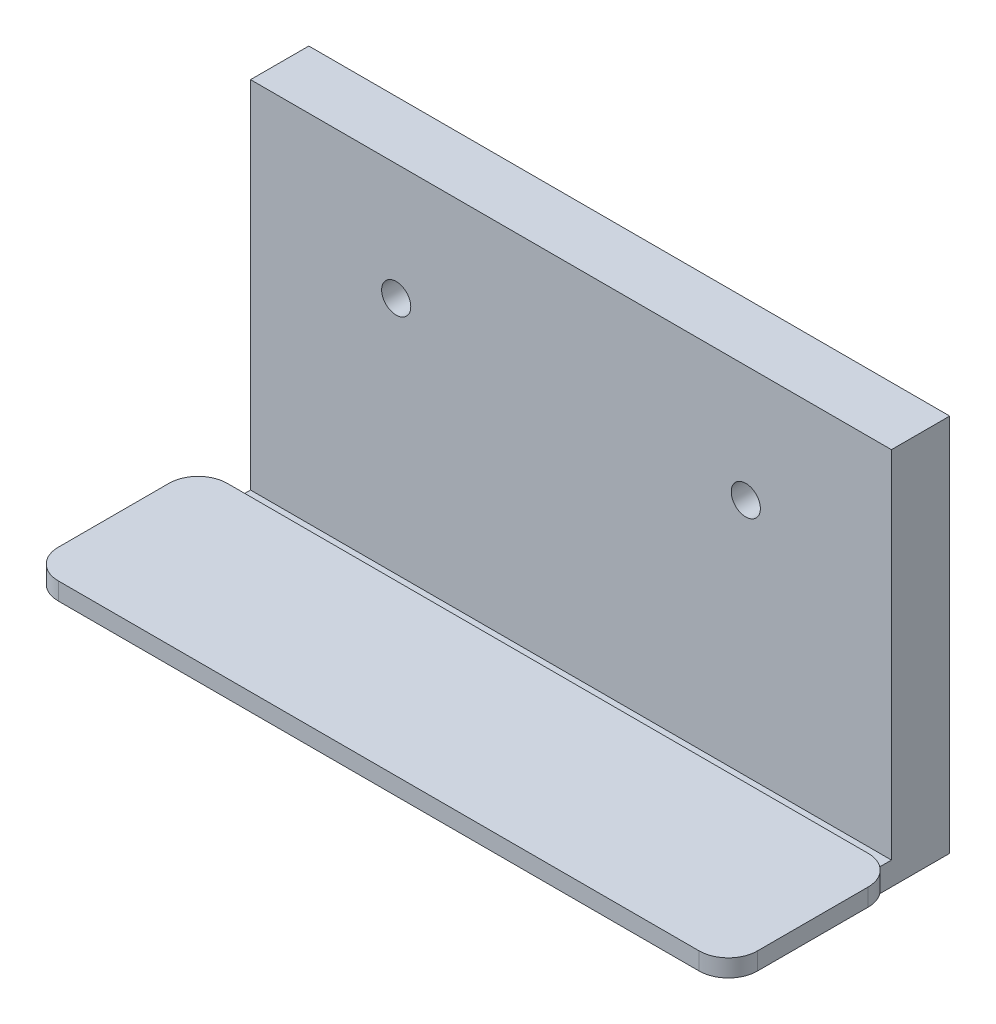
ISO-10303-21;
HEADER;
FILE_DESCRIPTION(('STEP AP214'),'2;1');
FILE_NAME('part.step','',(''),(''),'','','');
FILE_SCHEMA(('AUTOMOTIVE_DESIGN { 1 0 10303 214 1 1 1 1 }'));
ENDSEC;
DATA;
#1=APPLICATION_CONTEXT('core data for automotive mechanical design processes');
#2=APPLICATION_PROTOCOL_DEFINITION('international standard','automotive_design',2000,#1);
#3=PRODUCT_CONTEXT('',#1,'mechanical');
#4=PRODUCT('Part','Part','',(#3));
#5=PRODUCT_RELATED_PRODUCT_CATEGORY('part','',(#4));
#6=PRODUCT_DEFINITION_FORMATION('','',#4);
#7=PRODUCT_DEFINITION_CONTEXT('part definition',#1,'design');
#8=PRODUCT_DEFINITION('design','',#6,#7);
#9=PRODUCT_DEFINITION_SHAPE('','',#8);
#10=(LENGTH_UNIT() NAMED_UNIT(*) SI_UNIT(.MILLI.,.METRE.));
#11=(NAMED_UNIT(*) PLANE_ANGLE_UNIT() SI_UNIT($,.RADIAN.));
#12=(NAMED_UNIT(*) SI_UNIT($,.STERADIAN.) SOLID_ANGLE_UNIT());
#13=UNCERTAINTY_MEASURE_WITH_UNIT(LENGTH_MEASURE(1.E-05),#10,'distance_accuracy_value','');
#14=(GEOMETRIC_REPRESENTATION_CONTEXT(3) GLOBAL_UNCERTAINTY_ASSIGNED_CONTEXT((#13)) GLOBAL_UNIT_ASSIGNED_CONTEXT((#10,
#11,#12)) REPRESENTATION_CONTEXT('',''));
#15=CARTESIAN_POINT('',(0.,0.,0.));
#16=DIRECTION('',(0.,0.,1.));
#17=DIRECTION('',(1.,0.,0.));
#18=AXIS2_PLACEMENT_3D('',#15,#16,#17);
#19=CARTESIAN_POINT('',(-55.,-28.5,30.));
#20=DIRECTION('',(0.,-1.,0.));
#21=DIRECTION('',(0.,0.,-1.));
#22=AXIS2_PLACEMENT_3D('',#19,#20,#21);
#23=PLANE('',#22);
#24=DIRECTION('',(-1.,0.,0.));
#25=VECTOR('',#24,1.);
#26=CARTESIAN_POINT('',(60.,-28.5,14.));
#27=LINE('',#26,#25);
#28=CARTESIAN_POINT('',(55.,-28.5,14.));
#29=VERTEX_POINT('',#28);
#30=CARTESIAN_POINT('',(-55.,-28.5,14.));
#31=VERTEX_POINT('',#30);
#32=EDGE_CURVE('E152',#29,#31,#27,.T.);
#33=ORIENTED_EDGE('',*,*,#32,.F.);
#34=DIRECTION('',(0.,0.,-1.));
#35=VECTOR('',#34,1.);
#36=CARTESIAN_POINT('',(55.,-28.5,30.));
#37=LINE('',#36,#35);
#38=CARTESIAN_POINT('',(55.,-28.5,10.));
#39=VERTEX_POINT('',#38);
#40=EDGE_CURVE('E169',#29,#39,#37,.T.);
#41=ORIENTED_EDGE('',*,*,#40,.T.);
#42=DIRECTION('',(-1.,0.,0.));
#43=VECTOR('',#42,1.);
#44=CARTESIAN_POINT('',(-55.,-28.5,10.));
#45=LINE('',#44,#43);
#46=CARTESIAN_POINT('',(-55.,-28.5,10.));
#47=VERTEX_POINT('',#46);
#48=EDGE_CURVE('E253',#39,#47,#45,.T.);
#49=ORIENTED_EDGE('',*,*,#48,.T.);
#50=DIRECTION('',(0.,0.,-1.));
#51=VECTOR('',#50,1.);
#52=CARTESIAN_POINT('',(-55.,-28.5,30.));
#53=LINE('',#52,#51);
#54=EDGE_CURVE('E174',#31,#47,#53,.T.);
#55=ORIENTED_EDGE('',*,*,#54,.F.);
#56=EDGE_LOOP('',(#33,#41,#49,#55));
#57=FACE_BOUND('',#56,.T.);
#58=ADVANCED_FACE('F32',(#57),#23,.F.);
#59=CARTESIAN_POINT('',(0.,0.,10.));
#60=DIRECTION('',(0.,0.,-1.));
#61=DIRECTION('',(-1.,0.,0.));
#62=AXIS2_PLACEMENT_3D('',#59,#60,#61);
#63=PLANE('',#62);
#64=CARTESIAN_POINT('',(30.,12.5,10.));
#65=DIRECTION('',(0.,0.,1.));
#66=DIRECTION('',(1.,0.,0.));
#67=AXIS2_PLACEMENT_3D('',#64,#65,#66);
#68=CIRCLE('',#67,2.5);
#69=CARTESIAN_POINT('',(32.5,12.5,10.));
#70=VERTEX_POINT('',#69);
#71=EDGE_CURVE('E274',#70,#70,#68,.T.);
#72=ORIENTED_EDGE('',*,*,#71,.F.);
#73=EDGE_LOOP('',(#72));
#74=FACE_BOUND('',#73,.T.);
#75=CARTESIAN_POINT('',(-30.,12.5,10.));
#76=DIRECTION('',(0.,0.,1.));
#77=DIRECTION('',(1.,0.,0.));
#78=AXIS2_PLACEMENT_3D('',#75,#76,#77);
#79=CIRCLE('',#78,2.5);
#80=CARTESIAN_POINT('',(-27.5,12.5,10.));
#81=VERTEX_POINT('',#80);
#82=EDGE_CURVE('E266',#81,#81,#79,.T.);
#83=ORIENTED_EDGE('',*,*,#82,.F.);
#84=EDGE_LOOP('',(#83));
#85=FACE_BOUND('',#84,.T.);
#86=ORIENTED_EDGE('',*,*,#48,.F.);
#87=DIRECTION('',(0.,1.,0.));
#88=VECTOR('',#87,1.);
#89=CARTESIAN_POINT('',(55.,-32.5,10.));
#90=LINE('',#89,#88);
#91=CARTESIAN_POINT('',(55.,32.5,10.));
#92=VERTEX_POINT('',#91);
#93=EDGE_CURVE('E183',#39,#92,#90,.T.);
#94=ORIENTED_EDGE('',*,*,#93,.T.);
#95=DIRECTION('',(-1.,0.,0.));
#96=VECTOR('',#95,1.);
#97=CARTESIAN_POINT('',(-55.,32.5,10.));
#98=LINE('',#97,#96);
#99=CARTESIAN_POINT('',(-55.,32.5,10.));
#100=VERTEX_POINT('',#99);
#101=EDGE_CURVE('E189',#92,#100,#98,.T.);
#102=ORIENTED_EDGE('',*,*,#101,.T.);
#103=DIRECTION('',(0.,-1.,0.));
#104=VECTOR('',#103,1.);
#105=CARTESIAN_POINT('',(-55.,-32.5,10.));
#106=LINE('',#105,#104);
#107=EDGE_CURVE('E192',#100,#47,#106,.T.);
#108=ORIENTED_EDGE('',*,*,#107,.T.);
#109=EDGE_LOOP('',(#86,#94,#102,#108));
#110=FACE_BOUND('',#109,.T.);
#111=ADVANCED_FACE('F293',(#74,#85,#110),#63,.F.);
#112=CARTESIAN_POINT('',(55.,-32.5,10.));
#113=DIRECTION('',(-1.,0.,0.));
#114=DIRECTION('',(0.,0.,1.));
#115=AXIS2_PLACEMENT_3D('',#112,#113,#114);
#116=PLANE('',#115);
#117=DIRECTION('',(0.,1.,0.));
#118=VECTOR('',#117,1.);
#119=CARTESIAN_POINT('',(55.,-32.5,0.));
#120=LINE('',#119,#118);
#121=CARTESIAN_POINT('',(55.,-32.5,0.));
#122=VERTEX_POINT('',#121);
#123=CARTESIAN_POINT('',(55.,32.5,0.));
#124=VERTEX_POINT('',#123);
#125=EDGE_CURVE('E168',#122,#124,#120,.T.);
#126=ORIENTED_EDGE('',*,*,#125,.T.);
#127=DIRECTION('',(0.,0.,-1.));
#128=VECTOR('',#127,1.);
#129=CARTESIAN_POINT('',(55.,32.5,10.));
#130=LINE('',#129,#128);
#131=EDGE_CURVE('E210',#92,#124,#130,.T.);
#132=ORIENTED_EDGE('',*,*,#131,.F.);
#133=ORIENTED_EDGE('',*,*,#93,.F.);
#134=ORIENTED_EDGE('',*,*,#40,.F.);
#135=CARTESIAN_POINT('',(55.,-28.5,30.));
#136=VERTEX_POINT('',#135);
#137=EDGE_CURVE('E160',#136,#29,#37,.T.);
#138=ORIENTED_EDGE('',*,*,#137,.F.);
#139=DIRECTION('',(0.,1.,0.));
#140=VECTOR('',#139,1.);
#141=CARTESIAN_POINT('',(55.,-32.5,30.));
#142=LINE('',#141,#140);
#143=CARTESIAN_POINT('',(55.,-32.5,30.));
#144=VERTEX_POINT('',#143);
#145=EDGE_CURVE('E256',#144,#136,#142,.T.);
#146=ORIENTED_EDGE('',*,*,#145,.F.);
#147=DIRECTION('',(0.,0.,-1.));
#148=VECTOR('',#147,1.);
#149=CARTESIAN_POINT('',(55.,-32.5,10.));
#150=LINE('',#149,#148);
#151=EDGE_CURVE('E195',#144,#122,#150,.T.);
#152=ORIENTED_EDGE('',*,*,#151,.T.);
#153=EDGE_LOOP('',(#126,#132,#133,#134,#138,#146,#152));
#154=FACE_BOUND('',#153,.T.);
#155=ADVANCED_FACE('F181',(#154),#116,.F.);
#156=CARTESIAN_POINT('',(-55.,32.5,10.));
#157=DIRECTION('',(0.,-1.,0.));
#158=DIRECTION('',(0.,0.,-1.));
#159=AXIS2_PLACEMENT_3D('',#156,#157,#158);
#160=PLANE('',#159);
#161=DIRECTION('',(-1.,0.,0.));
#162=VECTOR('',#161,1.);
#163=CARTESIAN_POINT('',(-55.,32.5,0.));
#164=LINE('',#163,#162);
#165=CARTESIAN_POINT('',(-55.,32.5,0.));
#166=VERTEX_POINT('',#165);
#167=EDGE_CURVE('E197',#124,#166,#164,.T.);
#168=ORIENTED_EDGE('',*,*,#167,.T.);
#169=DIRECTION('',(0.,0.,-1.));
#170=VECTOR('',#169,1.);
#171=CARTESIAN_POINT('',(-55.,32.5,10.));
#172=LINE('',#171,#170);
#173=EDGE_CURVE('E207',#100,#166,#172,.T.);
#174=ORIENTED_EDGE('',*,*,#173,.F.);
#175=ORIENTED_EDGE('',*,*,#101,.F.);
#176=ORIENTED_EDGE('',*,*,#131,.T.);
#177=EDGE_LOOP('',(#168,#174,#175,#176));
#178=FACE_BOUND('',#177,.T.);
#179=ADVANCED_FACE('F315',(#178),#160,.F.);
#180=CARTESIAN_POINT('',(-55.,-32.5,10.));
#181=DIRECTION('',(1.,0.,0.));
#182=DIRECTION('',(0.,0.,-1.));
#183=AXIS2_PLACEMENT_3D('',#180,#181,#182);
#184=PLANE('',#183);
#185=DIRECTION('',(0.,-1.,0.));
#186=VECTOR('',#185,1.);
#187=CARTESIAN_POINT('',(-55.,-32.5,0.));
#188=LINE('',#187,#186);
#189=CARTESIAN_POINT('',(-55.,-32.5,0.));
#190=VERTEX_POINT('',#189);
#191=EDGE_CURVE('E199',#166,#190,#188,.T.);
#192=ORIENTED_EDGE('',*,*,#191,.T.);
#193=DIRECTION('',(0.,0.,-1.));
#194=VECTOR('',#193,1.);
#195=CARTESIAN_POINT('',(-55.,-32.5,10.));
#196=LINE('',#195,#194);
#197=CARTESIAN_POINT('',(-55.,-32.5,30.));
#198=VERTEX_POINT('',#197);
#199=EDGE_CURVE('E204',#198,#190,#196,.T.);
#200=ORIENTED_EDGE('',*,*,#199,.F.);
#201=DIRECTION('',(0.,-1.,0.));
#202=VECTOR('',#201,1.);
#203=CARTESIAN_POINT('',(-55.,-32.5,30.));
#204=LINE('',#203,#202);
#205=CARTESIAN_POINT('',(-55.,-28.5,30.));
#206=VERTEX_POINT('',#205);
#207=EDGE_CURVE('E249',#206,#198,#204,.T.);
#208=ORIENTED_EDGE('',*,*,#207,.F.);
#209=EDGE_CURVE('E184',#206,#31,#53,.T.);
#210=ORIENTED_EDGE('',*,*,#209,.T.);
#211=ORIENTED_EDGE('',*,*,#54,.T.);
#212=ORIENTED_EDGE('',*,*,#107,.F.);
#213=ORIENTED_EDGE('',*,*,#173,.T.);
#214=EDGE_LOOP('',(#192,#200,#208,#210,#211,#212,#213));
#215=FACE_BOUND('',#214,.T.);
#216=ADVANCED_FACE('F311',(#215),#184,.F.);
#217=CARTESIAN_POINT('',(-55.,-32.5,10.));
#218=DIRECTION('',(0.,1.,0.));
#219=DIRECTION('',(0.,0.,1.));
#220=AXIS2_PLACEMENT_3D('',#217,#218,#219);
#221=PLANE('',#220);
#222=DIRECTION('',(1.,0.,0.));
#223=VECTOR('',#222,1.);
#224=CARTESIAN_POINT('',(-55.,-32.5,0.));
#225=LINE('',#224,#223);
#226=EDGE_CURVE('E190',#190,#122,#225,.T.);
#227=ORIENTED_EDGE('',*,*,#226,.T.);
#228=ORIENTED_EDGE('',*,*,#151,.F.);
#229=DIRECTION('',(1.,0.,0.));
#230=VECTOR('',#229,1.);
#231=CARTESIAN_POINT('',(-55.,-32.5,30.));
#232=LINE('',#231,#230);
#233=EDGE_CURVE('E252',#198,#144,#232,.T.);
#234=ORIENTED_EDGE('',*,*,#233,.F.);
#235=ORIENTED_EDGE('',*,*,#199,.T.);
#236=EDGE_LOOP('',(#227,#228,#234,#235));
#237=FACE_BOUND('',#236,.T.);
#238=ADVANCED_FACE('F307',(#237),#221,.F.);
#239=CARTESIAN_POINT('',(0.,0.,0.));
#240=DIRECTION('',(0.,0.,-1.));
#241=DIRECTION('',(-1.,0.,0.));
#242=AXIS2_PLACEMENT_3D('',#239,#240,#241);
#243=PLANE('',#242);
#244=CARTESIAN_POINT('',(30.,12.5,0.));
#245=DIRECTION('',(0.,0.,1.));
#246=DIRECTION('',(1.,0.,0.));
#247=AXIS2_PLACEMENT_3D('',#244,#245,#246);
#248=CIRCLE('',#247,2.5);
#249=CARTESIAN_POINT('',(32.5,12.5,0.));
#250=VERTEX_POINT('',#249);
#251=EDGE_CURVE('E271',#250,#250,#248,.T.);
#252=ORIENTED_EDGE('',*,*,#251,.T.);
#253=EDGE_LOOP('',(#252));
#254=FACE_BOUND('',#253,.T.);
#255=CARTESIAN_POINT('',(-30.,12.5,0.));
#256=DIRECTION('',(0.,0.,1.));
#257=DIRECTION('',(1.,0.,0.));
#258=AXIS2_PLACEMENT_3D('',#255,#256,#257);
#259=CIRCLE('',#258,2.5);
#260=CARTESIAN_POINT('',(-27.5,12.5,0.));
#261=VERTEX_POINT('',#260);
#262=EDGE_CURVE('E263',#261,#261,#259,.T.);
#263=ORIENTED_EDGE('',*,*,#262,.T.);
#264=EDGE_LOOP('',(#263));
#265=FACE_BOUND('',#264,.T.);
#266=ORIENTED_EDGE('',*,*,#125,.F.);
#267=ORIENTED_EDGE('',*,*,#226,.F.);
#268=ORIENTED_EDGE('',*,*,#191,.F.);
#269=ORIENTED_EDGE('',*,*,#167,.F.);
#270=EDGE_LOOP('',(#266,#267,#268,#269));
#271=FACE_BOUND('',#270,.T.);
#272=ADVANCED_FACE('F304',(#254,#265,#271),#243,.T.);
#273=CARTESIAN_POINT('',(0.,0.,30.));
#274=DIRECTION('',(0.,0.,-1.));
#275=DIRECTION('',(-1.,0.,0.));
#276=AXIS2_PLACEMENT_3D('',#273,#274,#275);
#277=PLANE('',#276);
#278=ORIENTED_EDGE('',*,*,#207,.T.);
#279=ORIENTED_EDGE('',*,*,#233,.T.);
#280=ORIENTED_EDGE('',*,*,#145,.T.);
#281=DIRECTION('',(-1.,0.,0.));
#282=VECTOR('',#281,1.);
#283=CARTESIAN_POINT('',(-55.,-28.5,30.));
#284=LINE('',#283,#282);
#285=EDGE_CURVE('E163',#136,#206,#284,.T.);
#286=ORIENTED_EDGE('',*,*,#285,.T.);
#287=EDGE_LOOP('',(#278,#279,#280,#286));
#288=FACE_BOUND('',#287,.T.);
#289=ADVANCED_FACE('F301',(#288),#277,.F.);
#290=CARTESIAN_POINT('',(0.,-28.5,0.));
#291=DIRECTION('',(0.,-1.,0.));
#292=DIRECTION('',(0.,0.,-1.));
#293=AXIS2_PLACEMENT_3D('',#290,#291,#292);
#294=PLANE('',#293);
#295=ORIENTED_EDGE('',*,*,#137,.T.);
#296=CARTESIAN_POINT('',(55.,-28.5,19.));
#297=DIRECTION('',(0.,-1.,0.));
#298=DIRECTION('',(0.,0.,-1.));
#299=AXIS2_PLACEMENT_3D('',#296,#297,#298);
#300=CIRCLE('',#299,5.);
#301=CARTESIAN_POINT('',(60.,-28.5,19.));
#302=VERTEX_POINT('',#301);
#303=EDGE_CURVE('E134',#29,#302,#300,.T.);
#304=ORIENTED_EDGE('',*,*,#303,.T.);
#305=DIRECTION('',(0.,0.,-1.));
#306=VECTOR('',#305,1.);
#307=CARTESIAN_POINT('',(60.,-28.5,14.));
#308=LINE('',#307,#306);
#309=CARTESIAN_POINT('',(60.,-28.5,38.));
#310=VERTEX_POINT('',#309);
#311=EDGE_CURVE('E177',#310,#302,#308,.T.);
#312=ORIENTED_EDGE('',*,*,#311,.F.);
#313=CARTESIAN_POINT('',(55.,-28.5,38.));
#314=DIRECTION('',(0.,-1.,0.));
#315=DIRECTION('',(0.,0.,-1.));
#316=AXIS2_PLACEMENT_3D('',#313,#314,#315);
#317=CIRCLE('',#316,5.);
#318=CARTESIAN_POINT('',(55.,-28.5,43.));
#319=VERTEX_POINT('',#318);
#320=EDGE_CURVE('E145',#310,#319,#317,.T.);
#321=ORIENTED_EDGE('',*,*,#320,.T.);
#322=DIRECTION('',(1.,0.,0.));
#323=VECTOR('',#322,1.);
#324=CARTESIAN_POINT('',(60.,-28.5,43.));
#325=LINE('',#324,#323);
#326=CARTESIAN_POINT('',(-55.,-28.5,43.));
#327=VERTEX_POINT('',#326);
#328=EDGE_CURVE('E243',#327,#319,#325,.T.);
#329=ORIENTED_EDGE('',*,*,#328,.F.);
#330=CARTESIAN_POINT('',(-55.,-28.5,38.));
#331=DIRECTION('',(0.,-1.,0.));
#332=DIRECTION('',(0.,0.,-1.));
#333=AXIS2_PLACEMENT_3D('',#330,#331,#332);
#334=CIRCLE('',#333,5.);
#335=CARTESIAN_POINT('',(-60.,-28.5,38.));
#336=VERTEX_POINT('',#335);
#337=EDGE_CURVE('E215',#327,#336,#334,.T.);
#338=ORIENTED_EDGE('',*,*,#337,.T.);
#339=DIRECTION('',(0.,0.,1.));
#340=VECTOR('',#339,1.);
#341=CARTESIAN_POINT('',(-60.,-28.5,14.));
#342=LINE('',#341,#340);
#343=CARTESIAN_POINT('',(-60.,-28.5,19.));
#344=VERTEX_POINT('',#343);
#345=EDGE_CURVE('E176',#344,#336,#342,.T.);
#346=ORIENTED_EDGE('',*,*,#345,.F.);
#347=CARTESIAN_POINT('',(-55.,-28.5,19.));
#348=DIRECTION('',(0.,-1.,0.));
#349=DIRECTION('',(0.,0.,-1.));
#350=AXIS2_PLACEMENT_3D('',#347,#348,#349);
#351=CIRCLE('',#350,5.);
#352=EDGE_CURVE('E156',#344,#31,#351,.T.);
#353=ORIENTED_EDGE('',*,*,#352,.T.);
#354=ORIENTED_EDGE('',*,*,#209,.F.);
#355=ORIENTED_EDGE('',*,*,#285,.F.);
#356=EDGE_LOOP('',(#295,#304,#312,#321,#329,#338,#346,#353,#354,#355));
#357=FACE_BOUND('',#356,.T.);
#358=ADVANCED_FACE('F161',(#357),#294,.T.);
#359=CARTESIAN_POINT('',(60.,-25.5,14.));
#360=DIRECTION('',(-1.,0.,0.));
#361=DIRECTION('',(0.,0.,1.));
#362=AXIS2_PLACEMENT_3D('',#359,#360,#361);
#363=PLANE('',#362);
#364=ORIENTED_EDGE('',*,*,#311,.T.);
#365=DIRECTION('',(0.,-1.,0.));
#366=VECTOR('',#365,1.);
#367=CARTESIAN_POINT('',(60.,-25.5,19.));
#368=LINE('',#367,#366);
#369=CARTESIAN_POINT('',(60.,-25.5,19.));
#370=VERTEX_POINT('',#369);
#371=EDGE_CURVE('E139',#302,#370,#368,.F.);
#372=ORIENTED_EDGE('',*,*,#371,.T.);
#373=DIRECTION('',(0.,0.,-1.));
#374=VECTOR('',#373,1.);
#375=CARTESIAN_POINT('',(60.,-25.5,14.));
#376=LINE('',#375,#374);
#377=CARTESIAN_POINT('',(60.,-25.5,38.));
#378=VERTEX_POINT('',#377);
#379=EDGE_CURVE('E245',#378,#370,#376,.T.);
#380=ORIENTED_EDGE('',*,*,#379,.F.);
#381=DIRECTION('',(0.,-1.,0.));
#382=VECTOR('',#381,1.);
#383=CARTESIAN_POINT('',(60.,-25.5,38.));
#384=LINE('',#383,#382);
#385=EDGE_CURVE('E144',#378,#310,#384,.T.);
#386=ORIENTED_EDGE('',*,*,#385,.T.);
#387=EDGE_LOOP('',(#364,#372,#380,#386));
#388=FACE_BOUND('',#387,.T.);
#389=ADVANCED_FACE('F330',(#388),#363,.F.);
#390=CARTESIAN_POINT('',(60.,-25.5,14.));
#391=DIRECTION('',(0.,0.,1.));
#392=DIRECTION('',(1.,0.,0.));
#393=AXIS2_PLACEMENT_3D('',#390,#391,#392);
#394=PLANE('',#393);
#395=DIRECTION('',(-1.,0.,0.));
#396=VECTOR('',#395,1.);
#397=CARTESIAN_POINT('',(60.,-25.5,14.));
#398=LINE('',#397,#396);
#399=CARTESIAN_POINT('',(55.,-25.5,14.));
#400=VERTEX_POINT('',#399);
#401=CARTESIAN_POINT('',(-55.,-25.5,14.));
#402=VERTEX_POINT('',#401);
#403=EDGE_CURVE('E155',#400,#402,#398,.T.);
#404=ORIENTED_EDGE('',*,*,#403,.F.);
#405=DIRECTION('',(0.,-1.,0.));
#406=VECTOR('',#405,1.);
#407=CARTESIAN_POINT('',(55.,-25.5,14.));
#408=LINE('',#407,#406);
#409=EDGE_CURVE('E138',#400,#29,#408,.T.);
#410=ORIENTED_EDGE('',*,*,#409,.T.);
#411=ORIENTED_EDGE('',*,*,#32,.T.);
#412=DIRECTION('',(0.,-1.,0.));
#413=VECTOR('',#412,1.);
#414=CARTESIAN_POINT('',(-55.,-25.5,14.));
#415=LINE('',#414,#413);
#416=EDGE_CURVE('E157',#31,#402,#415,.F.);
#417=ORIENTED_EDGE('',*,*,#416,.T.);
#418=EDGE_LOOP('',(#404,#410,#411,#417));
#419=FACE_BOUND('',#418,.T.);
#420=ADVANCED_FACE('F150',(#419),#394,.F.);
#421=CARTESIAN_POINT('',(-60.,-25.5,14.));
#422=DIRECTION('',(1.,0.,0.));
#423=DIRECTION('',(0.,0.,-1.));
#424=AXIS2_PLACEMENT_3D('',#421,#422,#423);
#425=PLANE('',#424);
#426=ORIENTED_EDGE('',*,*,#345,.T.);
#427=DIRECTION('',(0.,-1.,0.));
#428=VECTOR('',#427,1.);
#429=CARTESIAN_POINT('',(-60.,-25.5,38.));
#430=LINE('',#429,#428);
#431=CARTESIAN_POINT('',(-60.,-25.5,38.));
#432=VERTEX_POINT('',#431);
#433=EDGE_CURVE('E11',#336,#432,#430,.F.);
#434=ORIENTED_EDGE('',*,*,#433,.T.);
#435=DIRECTION('',(0.,0.,1.));
#436=VECTOR('',#435,1.);
#437=CARTESIAN_POINT('',(-60.,-25.5,14.));
#438=LINE('',#437,#436);
#439=CARTESIAN_POINT('',(-60.,-25.5,19.));
#440=VERTEX_POINT('',#439);
#441=EDGE_CURVE('E239',#440,#432,#438,.T.);
#442=ORIENTED_EDGE('',*,*,#441,.F.);
#443=DIRECTION('',(0.,-1.,0.));
#444=VECTOR('',#443,1.);
#445=CARTESIAN_POINT('',(-60.,-25.5,19.));
#446=LINE('',#445,#444);
#447=EDGE_CURVE('E40',#440,#344,#446,.T.);
#448=ORIENTED_EDGE('',*,*,#447,.T.);
#449=EDGE_LOOP('',(#426,#434,#442,#448));
#450=FACE_BOUND('',#449,.T.);
#451=ADVANCED_FACE('F237',(#450),#425,.F.);
#452=CARTESIAN_POINT('',(60.,-25.5,43.));
#453=DIRECTION('',(0.,0.,-1.));
#454=DIRECTION('',(-1.,0.,0.));
#455=AXIS2_PLACEMENT_3D('',#452,#453,#454);
#456=PLANE('',#455);
#457=ORIENTED_EDGE('',*,*,#328,.T.);
#458=DIRECTION('',(0.,-1.,0.));
#459=VECTOR('',#458,1.);
#460=CARTESIAN_POINT('',(55.,-25.5,43.));
#461=LINE('',#460,#459);
#462=CARTESIAN_POINT('',(55.,-25.5,43.));
#463=VERTEX_POINT('',#462);
#464=EDGE_CURVE('E47',#319,#463,#461,.F.);
#465=ORIENTED_EDGE('',*,*,#464,.T.);
#466=DIRECTION('',(1.,0.,0.));
#467=VECTOR('',#466,1.);
#468=CARTESIAN_POINT('',(60.,-25.5,43.));
#469=LINE('',#468,#467);
#470=CARTESIAN_POINT('',(-55.,-25.5,43.));
#471=VERTEX_POINT('',#470);
#472=EDGE_CURVE('E258',#471,#463,#469,.T.);
#473=ORIENTED_EDGE('',*,*,#472,.F.);
#474=DIRECTION('',(0.,-1.,0.));
#475=VECTOR('',#474,1.);
#476=CARTESIAN_POINT('',(-55.,-25.5,43.));
#477=LINE('',#476,#475);
#478=EDGE_CURVE('E228',#471,#327,#477,.T.);
#479=ORIENTED_EDGE('',*,*,#478,.T.);
#480=EDGE_LOOP('',(#457,#465,#473,#479));
#481=FACE_BOUND('',#480,.T.);
#482=ADVANCED_FACE('F331',(#481),#456,.F.);
#483=CARTESIAN_POINT('',(0.,-25.5,0.));
#484=DIRECTION('',(0.,-1.,0.));
#485=DIRECTION('',(0.,0.,-1.));
#486=AXIS2_PLACEMENT_3D('',#483,#484,#485);
#487=PLANE('',#486);
#488=ORIENTED_EDGE('',*,*,#379,.T.);
#489=CARTESIAN_POINT('',(55.,-25.5,19.));
#490=DIRECTION('',(0.,-1.,0.));
#491=DIRECTION('',(0.,0.,-1.));
#492=AXIS2_PLACEMENT_3D('',#489,#490,#491);
#493=CIRCLE('',#492,5.);
#494=EDGE_CURVE('E226',#370,#400,#493,.F.);
#495=ORIENTED_EDGE('',*,*,#494,.T.);
#496=ORIENTED_EDGE('',*,*,#403,.T.);
#497=CARTESIAN_POINT('',(-55.,-25.5,19.));
#498=DIRECTION('',(0.,-1.,0.));
#499=DIRECTION('',(0.,0.,-1.));
#500=AXIS2_PLACEMENT_3D('',#497,#498,#499);
#501=CIRCLE('',#500,5.);
#502=EDGE_CURVE('E221',#402,#440,#501,.F.);
#503=ORIENTED_EDGE('',*,*,#502,.T.);
#504=ORIENTED_EDGE('',*,*,#441,.T.);
#505=CARTESIAN_POINT('',(-55.,-25.5,38.));
#506=DIRECTION('',(0.,-1.,0.));
#507=DIRECTION('',(0.,0.,-1.));
#508=AXIS2_PLACEMENT_3D('',#505,#506,#507);
#509=CIRCLE('',#508,5.);
#510=EDGE_CURVE('E54',#432,#471,#509,.F.);
#511=ORIENTED_EDGE('',*,*,#510,.T.);
#512=ORIENTED_EDGE('',*,*,#472,.T.);
#513=CARTESIAN_POINT('',(55.,-25.5,38.));
#514=DIRECTION('',(0.,-1.,0.));
#515=DIRECTION('',(0.,0.,-1.));
#516=AXIS2_PLACEMENT_3D('',#513,#514,#515);
#517=CIRCLE('',#516,5.);
#518=EDGE_CURVE('E224',#463,#378,#517,.F.);
#519=ORIENTED_EDGE('',*,*,#518,.T.);
#520=EDGE_LOOP('',(#488,#495,#496,#503,#504,#511,#512,#519));
#521=FACE_BOUND('',#520,.T.);
#522=ADVANCED_FACE('F278',(#521),#487,.F.);
#523=CARTESIAN_POINT('',(55.,-25.5,19.));
#524=DIRECTION('',(0.,-1.,0.));
#525=DIRECTION('',(0.,0.,-1.));
#526=AXIS2_PLACEMENT_3D('',#523,#524,#525);
#527=CYLINDRICAL_SURFACE('',#526,5.);
#528=ORIENTED_EDGE('',*,*,#494,.F.);
#529=ORIENTED_EDGE('',*,*,#371,.F.);
#530=ORIENTED_EDGE('',*,*,#303,.F.);
#531=ORIENTED_EDGE('',*,*,#409,.F.);
#532=EDGE_LOOP('',(#528,#529,#530,#531));
#533=FACE_BOUND('',#532,.T.);
#534=ADVANCED_FACE('F137',(#533),#527,.T.);
#535=CARTESIAN_POINT('',(55.,-25.5,38.));
#536=DIRECTION('',(0.,-1.,0.));
#537=DIRECTION('',(0.,0.,-1.));
#538=AXIS2_PLACEMENT_3D('',#535,#536,#537);
#539=CYLINDRICAL_SURFACE('',#538,5.);
#540=ORIENTED_EDGE('',*,*,#518,.F.);
#541=ORIENTED_EDGE('',*,*,#464,.F.);
#542=ORIENTED_EDGE('',*,*,#320,.F.);
#543=ORIENTED_EDGE('',*,*,#385,.F.);
#544=EDGE_LOOP('',(#540,#541,#542,#543));
#545=FACE_BOUND('',#544,.T.);
#546=ADVANCED_FACE('F290',(#545),#539,.T.);
#547=CARTESIAN_POINT('',(-55.,-25.5,38.));
#548=DIRECTION('',(0.,-1.,0.));
#549=DIRECTION('',(0.,0.,-1.));
#550=AXIS2_PLACEMENT_3D('',#547,#548,#549);
#551=CYLINDRICAL_SURFACE('',#550,5.);
#552=ORIENTED_EDGE('',*,*,#510,.F.);
#553=ORIENTED_EDGE('',*,*,#433,.F.);
#554=ORIENTED_EDGE('',*,*,#337,.F.);
#555=ORIENTED_EDGE('',*,*,#478,.F.);
#556=EDGE_LOOP('',(#552,#553,#554,#555));
#557=FACE_BOUND('',#556,.T.);
#558=ADVANCED_FACE('F282',(#557),#551,.T.);
#559=CARTESIAN_POINT('',(-55.,-25.5,19.));
#560=DIRECTION('',(0.,-1.,0.));
#561=DIRECTION('',(0.,0.,-1.));
#562=AXIS2_PLACEMENT_3D('',#559,#560,#561);
#563=CYLINDRICAL_SURFACE('',#562,5.);
#564=ORIENTED_EDGE('',*,*,#502,.F.);
#565=ORIENTED_EDGE('',*,*,#416,.F.);
#566=ORIENTED_EDGE('',*,*,#352,.F.);
#567=ORIENTED_EDGE('',*,*,#447,.F.);
#568=EDGE_LOOP('',(#564,#565,#566,#567));
#569=FACE_BOUND('',#568,.T.);
#570=ADVANCED_FACE('F34',(#569),#563,.T.);
#571=CARTESIAN_POINT('',(-30.,12.5,0.));
#572=DIRECTION('',(0.,0.,1.));
#573=DIRECTION('',(1.,0.,0.));
#574=AXIS2_PLACEMENT_3D('',#571,#572,#573);
#575=CYLINDRICAL_SURFACE('',#574,2.5);
#576=ORIENTED_EDGE('',*,*,#262,.F.);
#577=EDGE_LOOP('',(#576));
#578=FACE_BOUND('',#577,.T.);
#579=ORIENTED_EDGE('',*,*,#82,.T.);
#580=EDGE_LOOP('',(#579));
#581=FACE_BOUND('',#580,.T.);
#582=ADVANCED_FACE('F281',(#578,#581),#575,.F.);
#583=CARTESIAN_POINT('',(30.,12.5,0.));
#584=DIRECTION('',(0.,0.,1.));
#585=DIRECTION('',(1.,0.,0.));
#586=AXIS2_PLACEMENT_3D('',#583,#584,#585);
#587=CYLINDRICAL_SURFACE('',#586,2.5);
#588=ORIENTED_EDGE('',*,*,#251,.F.);
#589=EDGE_LOOP('',(#588));
#590=FACE_BOUND('',#589,.T.);
#591=ORIENTED_EDGE('',*,*,#71,.T.);
#592=EDGE_LOOP('',(#591));
#593=FACE_BOUND('',#592,.T.);
#594=ADVANCED_FACE('F287',(#590,#593),#587,.F.);
#595=CLOSED_SHELL('',(#58,#111,#155,#179,#216,#238,#272,#289,#358,#389,#420,#451,#482,#522,#534,
#546,#558,#570,#582,#594));
#596=MANIFOLD_SOLID_BREP('B2',#595);
#597=ADVANCED_BREP_SHAPE_REPRESENTATION('',(#18,#596),#14);
#598=SHAPE_DEFINITION_REPRESENTATION(#9,#597);
ENDSEC;
END-ISO-10303-21;
